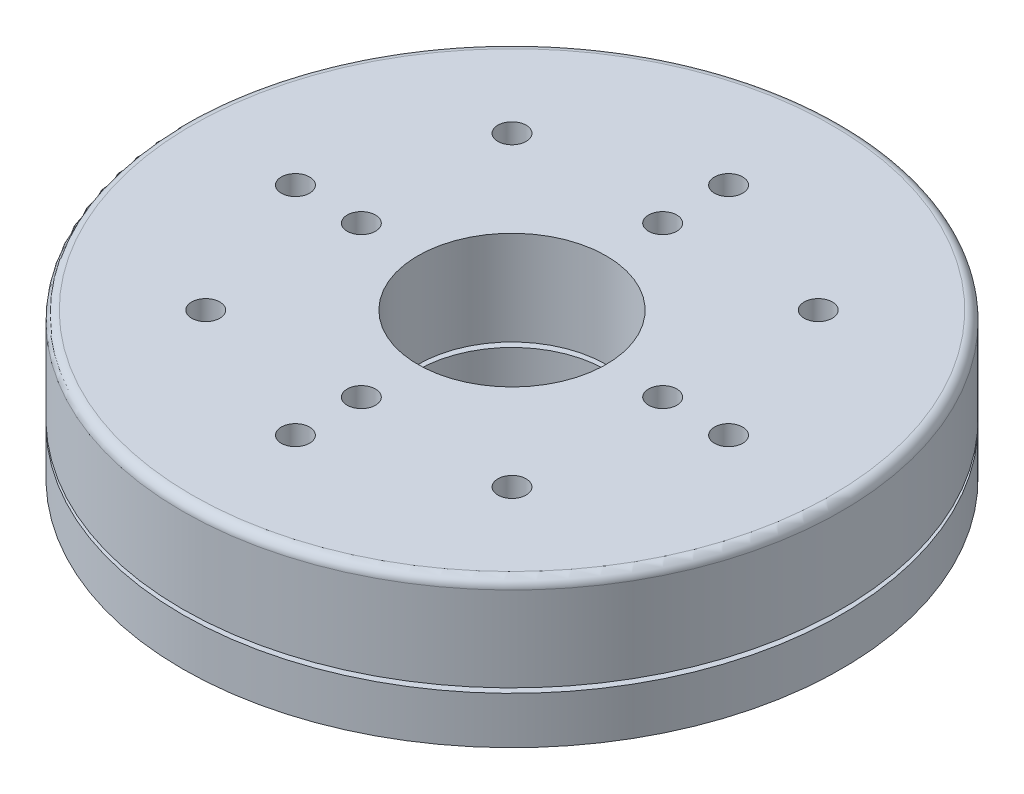
ISO-10303-21;
HEADER;
FILE_DESCRIPTION(('STEP AP214'),'2;1');
FILE_NAME('part.step','',(''),(''),'','','');
FILE_SCHEMA(('AUTOMOTIVE_DESIGN { 1 0 10303 214 1 1 1 1 }'));
ENDSEC;
DATA;
#1=APPLICATION_CONTEXT('core data for automotive mechanical design processes');
#2=APPLICATION_PROTOCOL_DEFINITION('international standard','automotive_design',2000,#1);
#3=PRODUCT_CONTEXT('',#1,'mechanical');
#4=PRODUCT('Part','Part','',(#3));
#5=PRODUCT_RELATED_PRODUCT_CATEGORY('part','',(#4));
#6=PRODUCT_DEFINITION_FORMATION('','',#4);
#7=PRODUCT_DEFINITION_CONTEXT('part definition',#1,'design');
#8=PRODUCT_DEFINITION('design','',#6,#7);
#9=PRODUCT_DEFINITION_SHAPE('','',#8);
#10=(LENGTH_UNIT() NAMED_UNIT(*) SI_UNIT(.MILLI.,.METRE.));
#11=(NAMED_UNIT(*) PLANE_ANGLE_UNIT() SI_UNIT($,.RADIAN.));
#12=(NAMED_UNIT(*) SI_UNIT($,.STERADIAN.) SOLID_ANGLE_UNIT());
#13=UNCERTAINTY_MEASURE_WITH_UNIT(LENGTH_MEASURE(1.E-05),#10,'distance_accuracy_value','');
#14=(GEOMETRIC_REPRESENTATION_CONTEXT(3) GLOBAL_UNCERTAINTY_ASSIGNED_CONTEXT((#13)) GLOBAL_UNIT_ASSIGNED_CONTEXT((#10,
#11,#12)) REPRESENTATION_CONTEXT('',''));
#15=CARTESIAN_POINT('',(0.,0.,0.));
#16=DIRECTION('',(0.,0.,1.));
#17=DIRECTION('',(1.,0.,0.));
#18=AXIS2_PLACEMENT_3D('',#15,#16,#17);
#19=CARTESIAN_POINT('',(0.,-5.5,0.));
#20=DIRECTION('',(0.,1.,0.));
#21=DIRECTION('',(0.,0.,1.));
#22=AXIS2_PLACEMENT_3D('',#19,#20,#21);
#23=CYLINDRICAL_SURFACE('',#22,35.);
#24=CARTESIAN_POINT('',(0.,-5.5,0.));
#25=DIRECTION('',(0.,-1.,0.));
#26=DIRECTION('',(0.,0.,-1.));
#27=AXIS2_PLACEMENT_3D('',#24,#25,#26);
#28=CIRCLE('',#27,35.);
#29=CARTESIAN_POINT('',(0.,-5.5,-35.));
#30=VERTEX_POINT('',#29);
#31=EDGE_CURVE('E11',#30,#30,#28,.T.);
#32=ORIENTED_EDGE('',*,*,#31,.F.);
#33=EDGE_LOOP('',(#32));
#34=FACE_BOUND('',#33,.T.);
#35=CARTESIAN_POINT('',(0.,-0.5,0.));
#36=DIRECTION('',(0.,-1.,0.));
#37=DIRECTION('',(0.,0.,-1.));
#38=AXIS2_PLACEMENT_3D('',#35,#36,#37);
#39=CIRCLE('',#38,35.);
#40=CARTESIAN_POINT('',(0.,-0.5,-35.));
#41=VERTEX_POINT('',#40);
#42=EDGE_CURVE('E48',#41,#41,#39,.T.);
#43=ORIENTED_EDGE('',*,*,#42,.T.);
#44=EDGE_LOOP('',(#43));
#45=FACE_BOUND('',#44,.T.);
#46=ADVANCED_FACE('F41',(#34,#45),#23,.T.);
#47=CARTESIAN_POINT('',(0.,-5.5,0.));
#48=DIRECTION('',(0.,-1.,0.));
#49=DIRECTION('',(0.,0.,-1.));
#50=AXIS2_PLACEMENT_3D('',#47,#48,#49);
#51=PLANE('',#50);
#52=CARTESIAN_POINT('',(0.,-5.5,0.));
#53=DIRECTION('',(0.,-1.,0.));
#54=DIRECTION('',(0.,0.,-1.));
#55=AXIS2_PLACEMENT_3D('',#52,#53,#54);
#56=CIRCLE('',#55,10.);
#57=CARTESIAN_POINT('',(0.,-5.5,-10.));
#58=VERTEX_POINT('',#57);
#59=EDGE_CURVE('E54',#58,#58,#56,.T.);
#60=ORIENTED_EDGE('',*,*,#59,.F.);
#61=EDGE_LOOP('',(#60));
#62=FACE_BOUND('',#61,.T.);
#63=ORIENTED_EDGE('',*,*,#31,.T.);
#64=EDGE_LOOP('',(#63));
#65=FACE_BOUND('',#64,.T.);
#66=ADVANCED_FACE('F70',(#62,#65),#51,.T.);
#67=CARTESIAN_POINT('',(0.,-0.5,0.));
#68=DIRECTION('',(0.,-1.,0.));
#69=DIRECTION('',(0.,0.,-1.));
#70=AXIS2_PLACEMENT_3D('',#67,#68,#69);
#71=PLANE('',#70);
#72=CARTESIAN_POINT('',(0.,-0.5,0.));
#73=DIRECTION('',(0.,-1.,0.));
#74=DIRECTION('',(0.,0.,-1.));
#75=AXIS2_PLACEMENT_3D('',#72,#73,#74);
#76=CIRCLE('',#75,10.);
#77=CARTESIAN_POINT('',(0.,-0.5,-10.));
#78=VERTEX_POINT('',#77);
#79=EDGE_CURVE('E44',#78,#78,#76,.T.);
#80=ORIENTED_EDGE('',*,*,#79,.T.);
#81=EDGE_LOOP('',(#80));
#82=FACE_BOUND('',#81,.T.);
#83=ORIENTED_EDGE('',*,*,#42,.F.);
#84=EDGE_LOOP('',(#83));
#85=FACE_BOUND('',#84,.T.);
#86=ADVANCED_FACE('F61',(#82,#85),#71,.F.);
#87=CARTESIAN_POINT('',(0.,10.,0.));
#88=DIRECTION('',(0.,-1.,0.));
#89=DIRECTION('',(0.,0.,-1.));
#90=AXIS2_PLACEMENT_3D('',#87,#88,#89);
#91=CYLINDRICAL_SURFACE('',#90,10.);
#92=CARTESIAN_POINT('',(0.,-5.5,-10.));
#93=CARTESIAN_POINT('',(0.,-5.44791666666666,-10.));
#94=CARTESIAN_POINT('',(0.,-5.39583333333333,-10.));
#95=CARTESIAN_POINT('',(0.,-5.29166666666666,-10.));
#96=CARTESIAN_POINT('',(0.,-5.23958333333333,-10.));
#97=CARTESIAN_POINT('',(0.,-5.13541666666666,-10.));
#98=CARTESIAN_POINT('',(0.,-5.08333333333333,-10.));
#99=CARTESIAN_POINT('',(0.,-4.97916666666666,-10.));
#100=CARTESIAN_POINT('',(0.,-4.92708333333333,-10.));
#101=CARTESIAN_POINT('',(0.,-4.82291666666666,-10.));
#102=CARTESIAN_POINT('',(0.,-4.77083333333333,-10.));
#103=CARTESIAN_POINT('',(0.,-4.66666666666667,-10.));
#104=CARTESIAN_POINT('',(0.,-4.61458333333333,-10.));
#105=CARTESIAN_POINT('',(0.,-4.51041666666667,-10.));
#106=CARTESIAN_POINT('',(0.,-4.45833333333333,-10.));
#107=CARTESIAN_POINT('',(0.,-4.35416666666667,-10.));
#108=CARTESIAN_POINT('',(0.,-4.30208333333333,-10.));
#109=CARTESIAN_POINT('',(0.,-4.19791666666667,-10.));
#110=CARTESIAN_POINT('',(0.,-4.14583333333333,-10.));
#111=CARTESIAN_POINT('',(0.,-4.04166666666667,-10.));
#112=CARTESIAN_POINT('',(0.,-3.98958333333333,-10.));
#113=CARTESIAN_POINT('',(0.,-3.88541666666667,-10.));
#114=CARTESIAN_POINT('',(0.,-3.83333333333333,-10.));
#115=CARTESIAN_POINT('',(0.,-3.72916666666667,-10.));
#116=CARTESIAN_POINT('',(0.,-3.67708333333333,-10.));
#117=CARTESIAN_POINT('',(0.,-3.57291666666667,-10.));
#118=CARTESIAN_POINT('',(0.,-3.52083333333333,-10.));
#119=CARTESIAN_POINT('',(0.,-3.41666666666667,-10.));
#120=CARTESIAN_POINT('',(0.,-3.36458333333333,-10.));
#121=CARTESIAN_POINT('',(0.,-3.26041666666667,-10.));
#122=CARTESIAN_POINT('',(0.,-3.20833333333333,-10.));
#123=CARTESIAN_POINT('',(0.,-3.10416666666667,-10.));
#124=CARTESIAN_POINT('',(0.,-3.05208333333333,-10.));
#125=CARTESIAN_POINT('',(0.,-2.94791666666667,-10.));
#126=CARTESIAN_POINT('',(0.,-2.89583333333333,-10.));
#127=CARTESIAN_POINT('',(0.,-2.79166666666667,-10.));
#128=CARTESIAN_POINT('',(0.,-2.73958333333333,-10.));
#129=CARTESIAN_POINT('',(0.,-2.63541666666667,-10.));
#130=CARTESIAN_POINT('',(0.,-2.58333333333333,-10.));
#131=CARTESIAN_POINT('',(0.,-2.47916666666667,-10.));
#132=CARTESIAN_POINT('',(0.,-2.42708333333333,-10.));
#133=CARTESIAN_POINT('',(0.,-2.32291666666667,-10.));
#134=CARTESIAN_POINT('',(0.,-2.27083333333333,-10.));
#135=CARTESIAN_POINT('',(0.,-2.16666666666667,-10.));
#136=CARTESIAN_POINT('',(0.,-2.11458333333333,-10.));
#137=CARTESIAN_POINT('',(0.,-2.01041666666667,-10.));
#138=CARTESIAN_POINT('',(0.,-1.95833333333333,-10.));
#139=CARTESIAN_POINT('',(0.,-1.85416666666667,-10.));
#140=CARTESIAN_POINT('',(0.,-1.80208333333333,-10.));
#141=CARTESIAN_POINT('',(0.,-1.69791666666667,-10.));
#142=CARTESIAN_POINT('',(0.,-1.64583333333333,-10.));
#143=CARTESIAN_POINT('',(0.,-1.54166666666667,-10.));
#144=CARTESIAN_POINT('',(0.,-1.48958333333333,-10.));
#145=CARTESIAN_POINT('',(0.,-1.38541666666667,-10.));
#146=CARTESIAN_POINT('',(0.,-1.33333333333333,-10.));
#147=CARTESIAN_POINT('',(0.,-1.22916666666667,-10.));
#148=CARTESIAN_POINT('',(0.,-1.17708333333333,-10.));
#149=CARTESIAN_POINT('',(0.,-1.07291666666667,-10.));
#150=CARTESIAN_POINT('',(0.,-1.02083333333333,-10.));
#151=CARTESIAN_POINT('',(0.,-0.916666666666668,-10.));
#152=CARTESIAN_POINT('',(0.,-0.864583333333334,-10.));
#153=CARTESIAN_POINT('',(0.,-0.760416666666667,-10.));
#154=CARTESIAN_POINT('',(0.,-0.708333333333334,-10.));
#155=CARTESIAN_POINT('',(0.,-0.604166666666667,-10.));
#156=CARTESIAN_POINT('',(0.,-0.552083333333334,-10.));
#157=CARTESIAN_POINT('',(0.,-0.5,-10.));
#158=B_SPLINE_CURVE_WITH_KNOTS('',3,(#92,#93,#94,#95,#96,#97,#98,#99,#100,#101,#102,#103,#104,
#105,#106,#107,#108,#109,#110,#111,#112,#113,#114,#115,#116,#117,#118,#119,#120,#121,#122,#123,
#124,#125,#126,#127,#128,#129,#130,#131,#132,#133,#134,#135,#136,#137,#138,#139,#140,#141,#142,
#143,#144,#145,#146,#147,#148,#149,#150,#151,#152,#153,#154,#155,#156,#157),.UNSPECIFIED.,.F.,
.F.,(4,2,2,2,2,2,2,2,2,2,2,2,2,2,2,2,2,2,2,2,2,2,2,2,2,2,2,2,2,2,2,2,4),(0.,0.15625,0.3125,
0.46875,0.625000000000001,0.781249999999999,0.937499999999999,1.09375,1.25,1.40625,1.5625,
1.71875,1.875,2.03125,2.1875,2.34375,2.5,2.65625,2.8125,2.96875,3.125,3.28125,3.4375,3.59375,
3.75,3.90625,4.0625,4.21875,4.375,4.53125,4.6875,4.84375,5.),.UNSPECIFIED.);
#159=EDGE_CURVE('BSEAM64',#58,#78,#158,.T.);
#160=ORIENTED_EDGE('',*,*,#59,.T.);
#161=ORIENTED_EDGE('',*,*,#79,.F.);
#162=ORIENTED_EDGE('',*,*,#159,.T.);
#163=ORIENTED_EDGE('',*,*,#159,.F.);
#164=EDGE_LOOP('',(#160,#162,#161,#163));
#165=FACE_BOUND('',#164,.T.);
#166=ADVANCED_FACE('F64',(#165),#91,.F.);
#167=CLOSED_SHELL('',(#46,#66,#86,#166));
#168=MANIFOLD_SOLID_BREP('B2',#167);
#169=CARTESIAN_POINT('',(0.,10.,0.));
#170=DIRECTION('',(0.,-1.,0.));
#171=DIRECTION('',(0.,0.,-1.));
#172=AXIS2_PLACEMENT_3D('',#169,#170,#171);
#173=CYLINDRICAL_SURFACE('',#172,35.);
#174=CARTESIAN_POINT('',(0.,9.,0.));
#175=DIRECTION('',(0.,1.,0.));
#176=DIRECTION('',(0.,0.,1.));
#177=AXIS2_PLACEMENT_3D('',#174,#175,#176);
#178=CIRCLE('',#177,35.);
#179=CARTESIAN_POINT('',(0.,9.,35.));
#180=VERTEX_POINT('',#179);
#181=EDGE_CURVE('E40',#180,#180,#178,.F.);
#182=ORIENTED_EDGE('',*,*,#181,.T.);
#183=EDGE_LOOP('',(#182));
#184=FACE_BOUND('',#183,.T.);
#185=CARTESIAN_POINT('',(0.,0.,0.));
#186=DIRECTION('',(0.,1.,0.));
#187=DIRECTION('',(0.,0.,1.));
#188=AXIS2_PLACEMENT_3D('',#185,#186,#187);
#189=CIRCLE('',#188,35.);
#190=CARTESIAN_POINT('',(0.,0.,35.));
#191=VERTEX_POINT('',#190);
#192=EDGE_CURVE('E115',#191,#191,#189,.T.);
#193=ORIENTED_EDGE('',*,*,#192,.T.);
#194=EDGE_LOOP('',(#193));
#195=FACE_BOUND('',#194,.T.);
#196=ADVANCED_FACE('F103',(#184,#195),#173,.T.);
#197=CARTESIAN_POINT('',(0.,10.,0.));
#198=DIRECTION('',(0.,1.,0.));
#199=DIRECTION('',(0.,0.,1.));
#200=AXIS2_PLACEMENT_3D('',#197,#198,#199);
#201=PLANE('',#200);
#202=CARTESIAN_POINT('',(0.,10.,0.));
#203=DIRECTION('',(0.,-1.,0.));
#204=DIRECTION('',(0.,0.,-1.));
#205=AXIS2_PLACEMENT_3D('',#202,#203,#204);
#206=CIRCLE('',#205,10.);
#207=CARTESIAN_POINT('',(0.,10.,-10.));
#208=VERTEX_POINT('',#207);
#209=EDGE_CURVE('E192',#208,#208,#206,.T.);
#210=ORIENTED_EDGE('',*,*,#209,.T.);
#211=EDGE_LOOP('',(#210));
#212=FACE_BOUND('',#211,.T.);
#213=CARTESIAN_POINT('',(-16.2634559672908,10.,16.2634559672904));
#214=DIRECTION('',(0.,1.,0.));
#215=DIRECTION('',(0.,0.,1.));
#216=AXIS2_PLACEMENT_3D('',#213,#214,#215);
#217=CIRCLE('',#216,1.5);
#218=CARTESIAN_POINT('',(-16.2634559672908,10.,17.7634559672904));
#219=VERTEX_POINT('',#218);
#220=EDGE_CURVE('E157',#219,#219,#217,.T.);
#221=ORIENTED_EDGE('',*,*,#220,.F.);
#222=EDGE_LOOP('',(#221));
#223=FACE_BOUND('',#222,.T.);
#224=CARTESIAN_POINT('',(-2.40912212380176E-13,10.,23.));
#225=DIRECTION('',(0.,1.,0.));
#226=DIRECTION('',(0.,0.,1.));
#227=AXIS2_PLACEMENT_3D('',#224,#225,#226);
#228=CIRCLE('',#227,1.5);
#229=CARTESIAN_POINT('',(-2.40912212380176E-13,10.,24.5));
#230=VERTEX_POINT('',#229);
#231=EDGE_CURVE('E163',#230,#230,#228,.T.);
#232=ORIENTED_EDGE('',*,*,#231,.F.);
#233=EDGE_LOOP('',(#232));
#234=FACE_BOUND('',#233,.T.);
#235=CARTESIAN_POINT('',(16.2634559672905,10.,16.2634559672907));
#236=DIRECTION('',(0.,1.,0.));
#237=DIRECTION('',(0.,0.,1.));
#238=AXIS2_PLACEMENT_3D('',#235,#236,#237);
#239=CIRCLE('',#238,1.5);
#240=CARTESIAN_POINT('',(16.2634559672905,10.,17.7634559672907));
#241=VERTEX_POINT('',#240);
#242=EDGE_CURVE('E169',#241,#241,#239,.T.);
#243=ORIENTED_EDGE('',*,*,#242,.F.);
#244=EDGE_LOOP('',(#243));
#245=FACE_BOUND('',#244,.T.);
#246=CARTESIAN_POINT('',(23.,10.,1.60608141586784E-13));
#247=DIRECTION('',(0.,1.,0.));
#248=DIRECTION('',(0.,0.,1.));
#249=AXIS2_PLACEMENT_3D('',#246,#247,#248);
#250=CIRCLE('',#249,1.5);
#251=CARTESIAN_POINT('',(23.,10.,1.50000000000016));
#252=VERTEX_POINT('',#251);
#253=EDGE_CURVE('E175',#252,#252,#250,.T.);
#254=ORIENTED_EDGE('',*,*,#253,.F.);
#255=EDGE_LOOP('',(#254));
#256=FACE_BOUND('',#255,.T.);
#257=CARTESIAN_POINT('',(16.2634559672907,10.,-16.2634559672905));
#258=DIRECTION('',(0.,1.,0.));
#259=DIRECTION('',(0.,0.,1.));
#260=AXIS2_PLACEMENT_3D('',#257,#258,#259);
#261=CIRCLE('',#260,1.5);
#262=CARTESIAN_POINT('',(16.2634559672907,10.,-14.7634559672905));
#263=VERTEX_POINT('',#262);
#264=EDGE_CURVE('E181',#263,#263,#261,.T.);
#265=ORIENTED_EDGE('',*,*,#264,.F.);
#266=EDGE_LOOP('',(#265));
#267=FACE_BOUND('',#266,.T.);
#268=CARTESIAN_POINT('',(0.,10.,-23.));
#269=DIRECTION('',(0.,1.,0.));
#270=DIRECTION('',(0.,0.,1.));
#271=AXIS2_PLACEMENT_3D('',#268,#269,#270);
#272=CIRCLE('',#271,1.5);
#273=CARTESIAN_POINT('',(0.,10.,-21.5));
#274=VERTEX_POINT('',#273);
#275=EDGE_CURVE('E187',#274,#274,#272,.T.);
#276=ORIENTED_EDGE('',*,*,#275,.F.);
#277=EDGE_LOOP('',(#276));
#278=FACE_BOUND('',#277,.T.);
#279=CARTESIAN_POINT('',(-16.,10.,0.));
#280=DIRECTION('',(0.,1.,0.));
#281=DIRECTION('',(0.,0.,1.));
#282=AXIS2_PLACEMENT_3D('',#279,#280,#281);
#283=CIRCLE('',#282,1.5);
#284=CARTESIAN_POINT('',(-16.,10.,1.5));
#285=VERTEX_POINT('',#284);
#286=EDGE_CURVE('E134',#285,#285,#283,.T.);
#287=ORIENTED_EDGE('',*,*,#286,.F.);
#288=EDGE_LOOP('',(#287));
#289=FACE_BOUND('',#288,.T.);
#290=CARTESIAN_POINT('',(0.00100000000005587,10.,-16.001));
#291=DIRECTION('',(0.,1.,0.));
#292=DIRECTION('',(0.,0.,1.));
#293=AXIS2_PLACEMENT_3D('',#290,#291,#292);
#294=CIRCLE('',#293,1.5);
#295=CARTESIAN_POINT('',(0.00100000000005587,10.,-14.501));
#296=VERTEX_POINT('',#295);
#297=EDGE_CURVE('E127',#296,#296,#294,.T.);
#298=ORIENTED_EDGE('',*,*,#297,.F.);
#299=EDGE_LOOP('',(#298));
#300=FACE_BOUND('',#299,.T.);
#301=CARTESIAN_POINT('',(16.002,10.,1.11734385805658E-13));
#302=DIRECTION('',(0.,1.,0.));
#303=DIRECTION('',(0.,0.,1.));
#304=AXIS2_PLACEMENT_3D('',#301,#302,#303);
#305=CIRCLE('',#304,1.5);
#306=CARTESIAN_POINT('',(16.002,10.,1.50000000000011));
#307=VERTEX_POINT('',#306);
#308=EDGE_CURVE('E152',#307,#307,#305,.T.);
#309=ORIENTED_EDGE('',*,*,#308,.F.);
#310=EDGE_LOOP('',(#309));
#311=FACE_BOUND('',#310,.T.);
#312=CARTESIAN_POINT('',(0.000999999999832398,10.,16.001));
#313=DIRECTION('',(0.,1.,0.));
#314=DIRECTION('',(0.,0.,1.));
#315=AXIS2_PLACEMENT_3D('',#312,#313,#314);
#316=CIRCLE('',#315,1.5);
#317=CARTESIAN_POINT('',(0.000999999999832398,10.,17.501));
#318=VERTEX_POINT('',#317);
#319=EDGE_CURVE('E146',#318,#318,#316,.T.);
#320=ORIENTED_EDGE('',*,*,#319,.F.);
#321=EDGE_LOOP('',(#320));
#322=FACE_BOUND('',#321,.T.);
#323=CARTESIAN_POINT('',(-16.2634559672906,10.,-16.2634559672906));
#324=DIRECTION('',(0.,1.,0.));
#325=DIRECTION('',(0.,0.,1.));
#326=AXIS2_PLACEMENT_3D('',#323,#324,#325);
#327=CIRCLE('',#326,1.5);
#328=CARTESIAN_POINT('',(-16.2634559672906,10.,-14.7634559672906));
#329=VERTEX_POINT('',#328);
#330=EDGE_CURVE('E139',#329,#329,#327,.T.);
#331=ORIENTED_EDGE('',*,*,#330,.F.);
#332=EDGE_LOOP('',(#331));
#333=FACE_BOUND('',#332,.T.);
#334=CARTESIAN_POINT('',(-23.,10.,0.));
#335=DIRECTION('',(0.,1.,0.));
#336=DIRECTION('',(0.,0.,1.));
#337=AXIS2_PLACEMENT_3D('',#334,#335,#336);
#338=CIRCLE('',#337,1.5);
#339=CARTESIAN_POINT('',(-23.,10.,1.5));
#340=VERTEX_POINT('',#339);
#341=EDGE_CURVE('E121',#340,#340,#338,.T.);
#342=ORIENTED_EDGE('',*,*,#341,.F.);
#343=EDGE_LOOP('',(#342));
#344=FACE_BOUND('',#343,.T.);
#345=CARTESIAN_POINT('',(0.,10.,0.));
#346=DIRECTION('',(0.,1.,0.));
#347=DIRECTION('',(0.,0.,1.));
#348=AXIS2_PLACEMENT_3D('',#345,#346,#347);
#349=CIRCLE('',#348,34.);
#350=CARTESIAN_POINT('',(0.,10.,34.));
#351=VERTEX_POINT('',#350);
#352=EDGE_CURVE('E111',#351,#351,#349,.T.);
#353=ORIENTED_EDGE('',*,*,#352,.T.);
#354=EDGE_LOOP('',(#353));
#355=FACE_BOUND('',#354,.T.);
#356=ADVANCED_FACE('F215',(#212,#223,#234,#245,#256,#267,#278,#289,#300,#311,#322,#333,#344,
#355),#201,.T.);
#357=CARTESIAN_POINT('',(0.,0.,0.));
#358=DIRECTION('',(0.,1.,0.));
#359=DIRECTION('',(0.,0.,1.));
#360=AXIS2_PLACEMENT_3D('',#357,#358,#359);
#361=PLANE('',#360);
#362=CARTESIAN_POINT('',(0.,0.,0.));
#363=DIRECTION('',(0.,1.,0.));
#364=DIRECTION('',(0.,0.,1.));
#365=AXIS2_PLACEMENT_3D('',#362,#363,#364);
#366=CIRCLE('',#365,10.);
#367=CARTESIAN_POINT('',(0.,0.,-10.));
#368=VERTEX_POINT('',#367);
#369=EDGE_CURVE('E107',#368,#368,#366,.T.);
#370=ORIENTED_EDGE('',*,*,#369,.T.);
#371=EDGE_LOOP('',(#370));
#372=FACE_BOUND('',#371,.T.);
#373=ORIENTED_EDGE('',*,*,#192,.F.);
#374=EDGE_LOOP('',(#373));
#375=FACE_BOUND('',#374,.T.);
#376=ADVANCED_FACE('F199',(#372,#375),#361,.F.);
#377=CARTESIAN_POINT('',(0.,9.,0.));
#378=DIRECTION('',(0.,1.,0.));
#379=DIRECTION('',(0.,0.,1.));
#380=AXIS2_PLACEMENT_3D('',#377,#378,#379);
#381=TOROIDAL_SURFACE('',#380,34.,1.);
#382=ORIENTED_EDGE('',*,*,#181,.F.);
#383=EDGE_LOOP('',(#382));
#384=FACE_BOUND('',#383,.T.);
#385=ORIENTED_EDGE('',*,*,#352,.F.);
#386=EDGE_LOOP('',(#385));
#387=FACE_BOUND('',#386,.T.);
#388=ADVANCED_FACE('F105',(#384,#387),#381,.T.);
#389=CARTESIAN_POINT('',(-23.,5.,0.));
#390=DIRECTION('',(0.,1.,0.));
#391=DIRECTION('',(0.,0.,1.));
#392=AXIS2_PLACEMENT_3D('',#389,#390,#391);
#393=CYLINDRICAL_SURFACE('',#392,1.5);
#394=CARTESIAN_POINT('',(-23.,5.,0.));
#395=DIRECTION('',(0.,1.,0.));
#396=DIRECTION('',(0.,0.,1.));
#397=AXIS2_PLACEMENT_3D('',#394,#395,#396);
#398=CIRCLE('',#397,1.5);
#399=CARTESIAN_POINT('',(-23.,5.,1.5));
#400=VERTEX_POINT('',#399);
#401=EDGE_CURVE('E120',#400,#400,#398,.T.);
#402=ORIENTED_EDGE('',*,*,#401,.F.);
#403=EDGE_LOOP('',(#402));
#404=FACE_BOUND('',#403,.T.);
#405=ORIENTED_EDGE('',*,*,#341,.T.);
#406=EDGE_LOOP('',(#405));
#407=FACE_BOUND('',#406,.T.);
#408=ADVANCED_FACE('F224',(#404,#407),#393,.F.);
#409=CARTESIAN_POINT('',(-23.,5.,0.));
#410=DIRECTION('',(0.,1.,0.));
#411=DIRECTION('',(0.,0.,1.));
#412=AXIS2_PLACEMENT_3D('',#409,#410,#411);
#413=PLANE('',#412);
#414=ORIENTED_EDGE('',*,*,#401,.T.);
#415=EDGE_LOOP('',(#414));
#416=FACE_BOUND('',#415,.T.);
#417=ADVANCED_FACE('F227',(#416),#413,.T.);
#418=CARTESIAN_POINT('',(-16.2634559672906,5.,-16.2634559672906));
#419=DIRECTION('',(0.,1.,0.));
#420=DIRECTION('',(0.,0.,1.));
#421=AXIS2_PLACEMENT_3D('',#418,#419,#420);
#422=CYLINDRICAL_SURFACE('',#421,1.5);
#423=CARTESIAN_POINT('',(-16.2634559672906,5.,-16.2634559672906));
#424=DIRECTION('',(0.,1.,0.));
#425=DIRECTION('',(0.,0.,1.));
#426=AXIS2_PLACEMENT_3D('',#423,#424,#425);
#427=CIRCLE('',#426,1.5);
#428=CARTESIAN_POINT('',(-16.2634559672906,5.,-14.7634559672906));
#429=VERTEX_POINT('',#428);
#430=EDGE_CURVE('E142',#429,#429,#427,.T.);
#431=ORIENTED_EDGE('',*,*,#430,.F.);
#432=EDGE_LOOP('',(#431));
#433=FACE_BOUND('',#432,.T.);
#434=ORIENTED_EDGE('',*,*,#330,.T.);
#435=EDGE_LOOP('',(#434));
#436=FACE_BOUND('',#435,.T.);
#437=ADVANCED_FACE('F231',(#433,#436),#422,.F.);
#438=CARTESIAN_POINT('',(-16.2634559672906,5.,-16.2634559672906));
#439=DIRECTION('',(0.,1.,0.));
#440=DIRECTION('',(0.,0.,1.));
#441=AXIS2_PLACEMENT_3D('',#438,#439,#440);
#442=PLANE('',#441);
#443=ORIENTED_EDGE('',*,*,#430,.T.);
#444=EDGE_LOOP('',(#443));
#445=FACE_BOUND('',#444,.T.);
#446=ADVANCED_FACE('F253',(#445),#442,.T.);
#447=CARTESIAN_POINT('',(0.000999999999832398,5.,16.001));
#448=DIRECTION('',(0.,1.,0.));
#449=DIRECTION('',(0.,0.,1.));
#450=AXIS2_PLACEMENT_3D('',#447,#448,#449);
#451=CYLINDRICAL_SURFACE('',#450,1.5);
#452=CARTESIAN_POINT('',(0.000999999999832398,5.,16.001));
#453=DIRECTION('',(0.,1.,0.));
#454=DIRECTION('',(0.,0.,1.));
#455=AXIS2_PLACEMENT_3D('',#452,#453,#454);
#456=CIRCLE('',#455,1.5);
#457=CARTESIAN_POINT('',(0.000999999999832398,5.,17.501));
#458=VERTEX_POINT('',#457);
#459=EDGE_CURVE('E149',#458,#458,#456,.T.);
#460=ORIENTED_EDGE('',*,*,#459,.F.);
#461=EDGE_LOOP('',(#460));
#462=FACE_BOUND('',#461,.T.);
#463=ORIENTED_EDGE('',*,*,#319,.T.);
#464=EDGE_LOOP('',(#463));
#465=FACE_BOUND('',#464,.T.);
#466=ADVANCED_FACE('F257',(#462,#465),#451,.F.);
#467=CARTESIAN_POINT('',(0.000999999999832398,5.,16.001));
#468=DIRECTION('',(0.,1.,0.));
#469=DIRECTION('',(0.,0.,1.));
#470=AXIS2_PLACEMENT_3D('',#467,#468,#469);
#471=PLANE('',#470);
#472=ORIENTED_EDGE('',*,*,#459,.T.);
#473=EDGE_LOOP('',(#472));
#474=FACE_BOUND('',#473,.T.);
#475=ADVANCED_FACE('F261',(#474),#471,.T.);
#476=CARTESIAN_POINT('',(16.002,5.,1.11734385805658E-13));
#477=DIRECTION('',(0.,1.,0.));
#478=DIRECTION('',(0.,0.,1.));
#479=AXIS2_PLACEMENT_3D('',#476,#477,#478);
#480=CYLINDRICAL_SURFACE('',#479,1.5);
#481=CARTESIAN_POINT('',(16.002,5.,1.11734385805658E-13));
#482=DIRECTION('',(0.,1.,0.));
#483=DIRECTION('',(0.,0.,1.));
#484=AXIS2_PLACEMENT_3D('',#481,#482,#483);
#485=CIRCLE('',#484,1.5);
#486=CARTESIAN_POINT('',(16.002,5.,1.50000000000011));
#487=VERTEX_POINT('',#486);
#488=EDGE_CURVE('E131',#487,#487,#485,.T.);
#489=ORIENTED_EDGE('',*,*,#488,.F.);
#490=EDGE_LOOP('',(#489));
#491=FACE_BOUND('',#490,.T.);
#492=ORIENTED_EDGE('',*,*,#308,.T.);
#493=EDGE_LOOP('',(#492));
#494=FACE_BOUND('',#493,.T.);
#495=ADVANCED_FACE('F265',(#491,#494),#480,.F.);
#496=CARTESIAN_POINT('',(16.002,5.,1.11734385805658E-13));
#497=DIRECTION('',(0.,1.,0.));
#498=DIRECTION('',(0.,0.,1.));
#499=AXIS2_PLACEMENT_3D('',#496,#497,#498);
#500=PLANE('',#499);
#501=ORIENTED_EDGE('',*,*,#488,.T.);
#502=EDGE_LOOP('',(#501));
#503=FACE_BOUND('',#502,.T.);
#504=ADVANCED_FACE('F237',(#503),#500,.T.);
#505=CARTESIAN_POINT('',(0.00100000000005587,5.,-16.001));
#506=DIRECTION('',(0.,1.,0.));
#507=DIRECTION('',(0.,0.,1.));
#508=AXIS2_PLACEMENT_3D('',#505,#506,#507);
#509=CYLINDRICAL_SURFACE('',#508,1.5);
#510=CARTESIAN_POINT('',(0.00100000000005587,5.,-16.001));
#511=DIRECTION('',(0.,1.,0.));
#512=DIRECTION('',(0.,0.,1.));
#513=AXIS2_PLACEMENT_3D('',#510,#511,#512);
#514=CIRCLE('',#513,1.5);
#515=CARTESIAN_POINT('',(0.00100000000005587,5.,-14.501));
#516=VERTEX_POINT('',#515);
#517=EDGE_CURVE('E130',#516,#516,#514,.T.);
#518=ORIENTED_EDGE('',*,*,#517,.F.);
#519=EDGE_LOOP('',(#518));
#520=FACE_BOUND('',#519,.T.);
#521=ORIENTED_EDGE('',*,*,#297,.T.);
#522=EDGE_LOOP('',(#521));
#523=FACE_BOUND('',#522,.T.);
#524=ADVANCED_FACE('F233',(#520,#523),#509,.F.);
#525=CARTESIAN_POINT('',(0.00100000000005587,5.,-16.001));
#526=DIRECTION('',(0.,1.,0.));
#527=DIRECTION('',(0.,0.,1.));
#528=AXIS2_PLACEMENT_3D('',#525,#526,#527);
#529=PLANE('',#528);
#530=ORIENTED_EDGE('',*,*,#517,.T.);
#531=EDGE_LOOP('',(#530));
#532=FACE_BOUND('',#531,.T.);
#533=ADVANCED_FACE('F236',(#532),#529,.T.);
#534=CARTESIAN_POINT('',(-16.,5.,0.));
#535=DIRECTION('',(0.,1.,0.));
#536=DIRECTION('',(0.,0.,1.));
#537=AXIS2_PLACEMENT_3D('',#534,#535,#536);
#538=CYLINDRICAL_SURFACE('',#537,1.5);
#539=CARTESIAN_POINT('',(-16.,5.,0.));
#540=DIRECTION('',(0.,1.,0.));
#541=DIRECTION('',(0.,0.,1.));
#542=AXIS2_PLACEMENT_3D('',#539,#540,#541);
#543=CIRCLE('',#542,1.5);
#544=CARTESIAN_POINT('',(-16.,5.,1.5));
#545=VERTEX_POINT('',#544);
#546=EDGE_CURVE('E124',#545,#545,#543,.T.);
#547=ORIENTED_EDGE('',*,*,#546,.F.);
#548=EDGE_LOOP('',(#547));
#549=FACE_BOUND('',#548,.T.);
#550=ORIENTED_EDGE('',*,*,#286,.T.);
#551=EDGE_LOOP('',(#550));
#552=FACE_BOUND('',#551,.T.);
#553=ADVANCED_FACE('F241',(#549,#552),#538,.F.);
#554=CARTESIAN_POINT('',(-16.,5.,0.));
#555=DIRECTION('',(0.,1.,0.));
#556=DIRECTION('',(0.,0.,1.));
#557=AXIS2_PLACEMENT_3D('',#554,#555,#556);
#558=PLANE('',#557);
#559=ORIENTED_EDGE('',*,*,#546,.T.);
#560=EDGE_LOOP('',(#559));
#561=FACE_BOUND('',#560,.T.);
#562=ADVANCED_FACE('F245',(#561),#558,.T.);
#563=CARTESIAN_POINT('',(0.,5.,-23.));
#564=DIRECTION('',(0.,1.,0.));
#565=DIRECTION('',(0.,0.,1.));
#566=AXIS2_PLACEMENT_3D('',#563,#564,#565);
#567=CYLINDRICAL_SURFACE('',#566,1.5);
#568=CARTESIAN_POINT('',(0.,5.,-23.));
#569=DIRECTION('',(0.,1.,0.));
#570=DIRECTION('',(0.,0.,1.));
#571=AXIS2_PLACEMENT_3D('',#568,#569,#570);
#572=CIRCLE('',#571,1.5);
#573=CARTESIAN_POINT('',(0.,5.,-21.5));
#574=VERTEX_POINT('',#573);
#575=EDGE_CURVE('E143',#574,#574,#572,.T.);
#576=ORIENTED_EDGE('',*,*,#575,.F.);
#577=EDGE_LOOP('',(#576));
#578=FACE_BOUND('',#577,.T.);
#579=ORIENTED_EDGE('',*,*,#275,.T.);
#580=EDGE_LOOP('',(#579));
#581=FACE_BOUND('',#580,.T.);
#582=ADVANCED_FACE('F249',(#578,#581),#567,.F.);
#583=CARTESIAN_POINT('',(0.,5.,-23.));
#584=DIRECTION('',(0.,1.,0.));
#585=DIRECTION('',(0.,0.,1.));
#586=AXIS2_PLACEMENT_3D('',#583,#584,#585);
#587=PLANE('',#586);
#588=ORIENTED_EDGE('',*,*,#575,.T.);
#589=EDGE_LOOP('',(#588));
#590=FACE_BOUND('',#589,.T.);
#591=ADVANCED_FACE('F304',(#590),#587,.T.);
#592=CARTESIAN_POINT('',(16.2634559672907,5.,-16.2634559672905));
#593=DIRECTION('',(0.,1.,0.));
#594=DIRECTION('',(0.,0.,1.));
#595=AXIS2_PLACEMENT_3D('',#592,#593,#594);
#596=CYLINDRICAL_SURFACE('',#595,1.5);
#597=CARTESIAN_POINT('',(16.2634559672907,5.,-16.2634559672905));
#598=DIRECTION('',(0.,1.,0.));
#599=DIRECTION('',(0.,0.,1.));
#600=AXIS2_PLACEMENT_3D('',#597,#598,#599);
#601=CIRCLE('',#600,1.5);
#602=CARTESIAN_POINT('',(16.2634559672907,5.,-14.7634559672905));
#603=VERTEX_POINT('',#602);
#604=EDGE_CURVE('E184',#603,#603,#601,.T.);
#605=ORIENTED_EDGE('',*,*,#604,.F.);
#606=EDGE_LOOP('',(#605));
#607=FACE_BOUND('',#606,.T.);
#608=ORIENTED_EDGE('',*,*,#264,.T.);
#609=EDGE_LOOP('',(#608));
#610=FACE_BOUND('',#609,.T.);
#611=ADVANCED_FACE('F301',(#607,#610),#596,.F.);
#612=CARTESIAN_POINT('',(16.2634559672907,5.,-16.2634559672905));
#613=DIRECTION('',(0.,1.,0.));
#614=DIRECTION('',(0.,0.,1.));
#615=AXIS2_PLACEMENT_3D('',#612,#613,#614);
#616=PLANE('',#615);
#617=ORIENTED_EDGE('',*,*,#604,.T.);
#618=EDGE_LOOP('',(#617));
#619=FACE_BOUND('',#618,.T.);
#620=ADVANCED_FACE('F296',(#619),#616,.T.);
#621=CARTESIAN_POINT('',(23.,5.,1.60608141586784E-13));
#622=DIRECTION('',(0.,1.,0.));
#623=DIRECTION('',(0.,0.,1.));
#624=AXIS2_PLACEMENT_3D('',#621,#622,#623);
#625=CYLINDRICAL_SURFACE('',#624,1.5);
#626=CARTESIAN_POINT('',(23.,5.,1.60608141586784E-13));
#627=DIRECTION('',(0.,1.,0.));
#628=DIRECTION('',(0.,0.,1.));
#629=AXIS2_PLACEMENT_3D('',#626,#627,#628);
#630=CIRCLE('',#629,1.5);
#631=CARTESIAN_POINT('',(23.,5.,1.50000000000016));
#632=VERTEX_POINT('',#631);
#633=EDGE_CURVE('E178',#632,#632,#630,.T.);
#634=ORIENTED_EDGE('',*,*,#633,.F.);
#635=EDGE_LOOP('',(#634));
#636=FACE_BOUND('',#635,.T.);
#637=ORIENTED_EDGE('',*,*,#253,.T.);
#638=EDGE_LOOP('',(#637));
#639=FACE_BOUND('',#638,.T.);
#640=ADVANCED_FACE('F293',(#636,#639),#625,.F.);
#641=CARTESIAN_POINT('',(23.,5.,1.60608141586784E-13));
#642=DIRECTION('',(0.,1.,0.));
#643=DIRECTION('',(0.,0.,1.));
#644=AXIS2_PLACEMENT_3D('',#641,#642,#643);
#645=PLANE('',#644);
#646=ORIENTED_EDGE('',*,*,#633,.T.);
#647=EDGE_LOOP('',(#646));
#648=FACE_BOUND('',#647,.T.);
#649=ADVANCED_FACE('F288',(#648),#645,.T.);
#650=CARTESIAN_POINT('',(16.2634559672905,5.,16.2634559672907));
#651=DIRECTION('',(0.,1.,0.));
#652=DIRECTION('',(0.,0.,1.));
#653=AXIS2_PLACEMENT_3D('',#650,#651,#652);
#654=CYLINDRICAL_SURFACE('',#653,1.5);
#655=CARTESIAN_POINT('',(16.2634559672905,5.,16.2634559672907));
#656=DIRECTION('',(0.,1.,0.));
#657=DIRECTION('',(0.,0.,1.));
#658=AXIS2_PLACEMENT_3D('',#655,#656,#657);
#659=CIRCLE('',#658,1.5);
#660=CARTESIAN_POINT('',(16.2634559672905,5.,17.7634559672907));
#661=VERTEX_POINT('',#660);
#662=EDGE_CURVE('E172',#661,#661,#659,.T.);
#663=ORIENTED_EDGE('',*,*,#662,.F.);
#664=EDGE_LOOP('',(#663));
#665=FACE_BOUND('',#664,.T.);
#666=ORIENTED_EDGE('',*,*,#242,.T.);
#667=EDGE_LOOP('',(#666));
#668=FACE_BOUND('',#667,.T.);
#669=ADVANCED_FACE('F285',(#665,#668),#654,.F.);
#670=CARTESIAN_POINT('',(16.2634559672905,5.,16.2634559672907));
#671=DIRECTION('',(0.,1.,0.));
#672=DIRECTION('',(0.,0.,1.));
#673=AXIS2_PLACEMENT_3D('',#670,#671,#672);
#674=PLANE('',#673);
#675=ORIENTED_EDGE('',*,*,#662,.T.);
#676=EDGE_LOOP('',(#675));
#677=FACE_BOUND('',#676,.T.);
#678=ADVANCED_FACE('F280',(#677),#674,.T.);
#679=CARTESIAN_POINT('',(-2.40912212380176E-13,5.,23.));
#680=DIRECTION('',(0.,1.,0.));
#681=DIRECTION('',(0.,0.,1.));
#682=AXIS2_PLACEMENT_3D('',#679,#680,#681);
#683=CYLINDRICAL_SURFACE('',#682,1.5);
#684=CARTESIAN_POINT('',(-2.40912212380176E-13,5.,23.));
#685=DIRECTION('',(0.,1.,0.));
#686=DIRECTION('',(0.,0.,1.));
#687=AXIS2_PLACEMENT_3D('',#684,#685,#686);
#688=CIRCLE('',#687,1.5);
#689=CARTESIAN_POINT('',(-2.40912212380176E-13,5.,24.5));
#690=VERTEX_POINT('',#689);
#691=EDGE_CURVE('E166',#690,#690,#688,.T.);
#692=ORIENTED_EDGE('',*,*,#691,.F.);
#693=EDGE_LOOP('',(#692));
#694=FACE_BOUND('',#693,.T.);
#695=ORIENTED_EDGE('',*,*,#231,.T.);
#696=EDGE_LOOP('',(#695));
#697=FACE_BOUND('',#696,.T.);
#698=ADVANCED_FACE('F277',(#694,#697),#683,.F.);
#699=CARTESIAN_POINT('',(-2.40912212380176E-13,5.,23.));
#700=DIRECTION('',(0.,1.,0.));
#701=DIRECTION('',(0.,0.,1.));
#702=AXIS2_PLACEMENT_3D('',#699,#700,#701);
#703=PLANE('',#702);
#704=ORIENTED_EDGE('',*,*,#691,.T.);
#705=EDGE_LOOP('',(#704));
#706=FACE_BOUND('',#705,.T.);
#707=ADVANCED_FACE('F274',(#706),#703,.T.);
#708=CARTESIAN_POINT('',(-16.2634559672908,5.,16.2634559672904));
#709=DIRECTION('',(0.,1.,0.));
#710=DIRECTION('',(0.,0.,1.));
#711=AXIS2_PLACEMENT_3D('',#708,#709,#710);
#712=CYLINDRICAL_SURFACE('',#711,1.5);
#713=CARTESIAN_POINT('',(-16.2634559672908,5.,16.2634559672904));
#714=DIRECTION('',(0.,1.,0.));
#715=DIRECTION('',(0.,0.,1.));
#716=AXIS2_PLACEMENT_3D('',#713,#714,#715);
#717=CIRCLE('',#716,1.5);
#718=CARTESIAN_POINT('',(-16.2634559672908,5.,17.7634559672904));
#719=VERTEX_POINT('',#718);
#720=EDGE_CURVE('E160',#719,#719,#717,.T.);
#721=ORIENTED_EDGE('',*,*,#720,.F.);
#722=EDGE_LOOP('',(#721));
#723=FACE_BOUND('',#722,.T.);
#724=ORIENTED_EDGE('',*,*,#220,.T.);
#725=EDGE_LOOP('',(#724));
#726=FACE_BOUND('',#725,.T.);
#727=ADVANCED_FACE('F210',(#723,#726),#712,.F.);
#728=CARTESIAN_POINT('',(-16.2634559672908,5.,16.2634559672904));
#729=DIRECTION('',(0.,1.,0.));
#730=DIRECTION('',(0.,0.,1.));
#731=AXIS2_PLACEMENT_3D('',#728,#729,#730);
#732=PLANE('',#731);
#733=ORIENTED_EDGE('',*,*,#720,.T.);
#734=EDGE_LOOP('',(#733));
#735=FACE_BOUND('',#734,.T.);
#736=ADVANCED_FACE('F204',(#735),#732,.T.);
#737=CARTESIAN_POINT('',(0.,10.,0.));
#738=DIRECTION('',(0.,-1.,0.));
#739=DIRECTION('',(0.,0.,-1.));
#740=AXIS2_PLACEMENT_3D('',#737,#738,#739);
#741=CYLINDRICAL_SURFACE('',#740,10.);
#742=CARTESIAN_POINT('',(0.,10.,-10.));
#743=CARTESIAN_POINT('',(0.,9.89583333333333,-10.));
#744=CARTESIAN_POINT('',(0.,9.79166666666667,-10.));
#745=CARTESIAN_POINT('',(0.,9.58333333333333,-10.));
#746=CARTESIAN_POINT('',(0.,9.47916666666667,-10.));
#747=CARTESIAN_POINT('',(0.,9.27083333333333,-10.));
#748=CARTESIAN_POINT('',(0.,9.16666666666667,-10.));
#749=CARTESIAN_POINT('',(0.,8.95833333333333,-10.));
#750=CARTESIAN_POINT('',(0.,8.85416666666667,-10.));
#751=CARTESIAN_POINT('',(0.,8.64583333333333,-10.));
#752=CARTESIAN_POINT('',(0.,8.54166666666667,-10.));
#753=CARTESIAN_POINT('',(0.,8.33333333333333,-10.));
#754=CARTESIAN_POINT('',(0.,8.22916666666667,-10.));
#755=CARTESIAN_POINT('',(0.,8.02083333333333,-10.));
#756=CARTESIAN_POINT('',(0.,7.91666666666667,-10.));
#757=CARTESIAN_POINT('',(0.,7.70833333333334,-10.));
#758=CARTESIAN_POINT('',(0.,7.60416666666667,-10.));
#759=CARTESIAN_POINT('',(0.,7.39583333333333,-10.));
#760=CARTESIAN_POINT('',(0.,7.29166666666667,-10.));
#761=CARTESIAN_POINT('',(0.,7.08333333333333,-10.));
#762=CARTESIAN_POINT('',(0.,6.97916666666667,-10.));
#763=CARTESIAN_POINT('',(0.,6.77083333333333,-10.));
#764=CARTESIAN_POINT('',(0.,6.66666666666667,-10.));
#765=CARTESIAN_POINT('',(0.,6.45833333333333,-10.));
#766=CARTESIAN_POINT('',(0.,6.35416666666667,-10.));
#767=CARTESIAN_POINT('',(0.,6.14583333333333,-10.));
#768=CARTESIAN_POINT('',(0.,6.04166666666667,-10.));
#769=CARTESIAN_POINT('',(0.,5.83333333333333,-10.));
#770=CARTESIAN_POINT('',(0.,5.72916666666667,-10.));
#771=CARTESIAN_POINT('',(0.,5.52083333333333,-10.));
#772=CARTESIAN_POINT('',(0.,5.41666666666667,-10.));
#773=CARTESIAN_POINT('',(0.,5.20833333333333,-10.));
#774=CARTESIAN_POINT('',(0.,5.10416666666667,-10.));
#775=CARTESIAN_POINT('',(0.,4.89583333333333,-10.));
#776=CARTESIAN_POINT('',(0.,4.79166666666667,-10.));
#777=CARTESIAN_POINT('',(0.,4.58333333333333,-10.));
#778=CARTESIAN_POINT('',(0.,4.47916666666667,-10.));
#779=CARTESIAN_POINT('',(0.,4.27083333333333,-10.));
#780=CARTESIAN_POINT('',(0.,4.16666666666667,-10.));
#781=CARTESIAN_POINT('',(0.,3.95833333333333,-10.));
#782=CARTESIAN_POINT('',(0.,3.85416666666667,-10.));
#783=CARTESIAN_POINT('',(0.,3.64583333333333,-10.));
#784=CARTESIAN_POINT('',(0.,3.54166666666667,-10.));
#785=CARTESIAN_POINT('',(0.,3.33333333333333,-10.));
#786=CARTESIAN_POINT('',(0.,3.22916666666667,-10.));
#787=CARTESIAN_POINT('',(0.,3.02083333333333,-10.));
#788=CARTESIAN_POINT('',(0.,2.91666666666667,-10.));
#789=CARTESIAN_POINT('',(0.,2.70833333333333,-10.));
#790=CARTESIAN_POINT('',(0.,2.60416666666667,-10.));
#791=CARTESIAN_POINT('',(0.,2.39583333333333,-10.));
#792=CARTESIAN_POINT('',(0.,2.29166666666667,-10.));
#793=CARTESIAN_POINT('',(0.,2.08333333333333,-10.));
#794=CARTESIAN_POINT('',(0.,1.97916666666667,-10.));
#795=CARTESIAN_POINT('',(0.,1.77083333333333,-10.));
#796=CARTESIAN_POINT('',(0.,1.66666666666667,-10.));
#797=CARTESIAN_POINT('',(0.,1.45833333333333,-10.));
#798=CARTESIAN_POINT('',(0.,1.35416666666667,-10.));
#799=CARTESIAN_POINT('',(0.,1.14583333333333,-10.));
#800=CARTESIAN_POINT('',(0.,1.04166666666667,-10.));
#801=CARTESIAN_POINT('',(0.,0.833333333333334,-10.));
#802=CARTESIAN_POINT('',(0.,0.729166666666667,-10.));
#803=CARTESIAN_POINT('',(0.,0.520833333333334,-10.));
#804=CARTESIAN_POINT('',(0.,0.416666666666667,-10.));
#805=CARTESIAN_POINT('',(0.,0.208333333333334,-10.));
#806=CARTESIAN_POINT('',(0.,0.104166666666667,-10.));
#807=CARTESIAN_POINT('',(0.,0.,-10.));
#808=B_SPLINE_CURVE_WITH_KNOTS('',3,(#742,#743,#744,#745,#746,#747,#748,#749,#750,#751,#752,
#753,#754,#755,#756,#757,#758,#759,#760,#761,#762,#763,#764,#765,#766,#767,#768,#769,#770,#771,
#772,#773,#774,#775,#776,#777,#778,#779,#780,#781,#782,#783,#784,#785,#786,#787,#788,#789,#790,
#791,#792,#793,#794,#795,#796,#797,#798,#799,#800,#801,#802,#803,#804,#805,#806,#807),
.UNSPECIFIED.,.F.,.F.,(4,2,2,2,2,2,2,2,2,2,2,2,2,2,2,2,2,2,2,2,2,2,2,2,2,2,2,2,2,2,2,2,4),(0.,
0.312499999999999,0.624999999999999,0.937499999999999,1.25,1.5625,1.875,2.1875,2.5,2.8125,3.125,
3.4375,3.75,4.0625,4.375,4.6875,5.,5.3125,5.625,5.9375,6.25,6.5625,6.875,7.1875,7.5,7.8125,
8.125,8.4375,8.75,9.0625,9.375,9.6875,10.),.UNSPECIFIED.);
#809=EDGE_CURVE('BSEAM202',#208,#368,#808,.T.);
#810=ORIENTED_EDGE('',*,*,#209,.F.);
#811=ORIENTED_EDGE('',*,*,#369,.F.);
#812=ORIENTED_EDGE('',*,*,#809,.T.);
#813=ORIENTED_EDGE('',*,*,#809,.F.);
#814=EDGE_LOOP('',(#810,#812,#811,#813));
#815=FACE_BOUND('',#814,.T.);
#816=ADVANCED_FACE('F202',(#815),#741,.F.);
#817=CLOSED_SHELL('',(#196,#356,#376,#388,#408,#417,#437,#446,#466,#475,#495,#504,#524,#533,
#553,#562,#582,#591,#611,#620,#640,#649,#669,#678,#698,#707,#727,#736,#816));
#818=MANIFOLD_SOLID_BREP('B6',#817);
#819=ADVANCED_BREP_SHAPE_REPRESENTATION('',(#18,#168,#818),#14);
#820=SHAPE_DEFINITION_REPRESENTATION(#9,#819);
ENDSEC;
END-ISO-10303-21;
